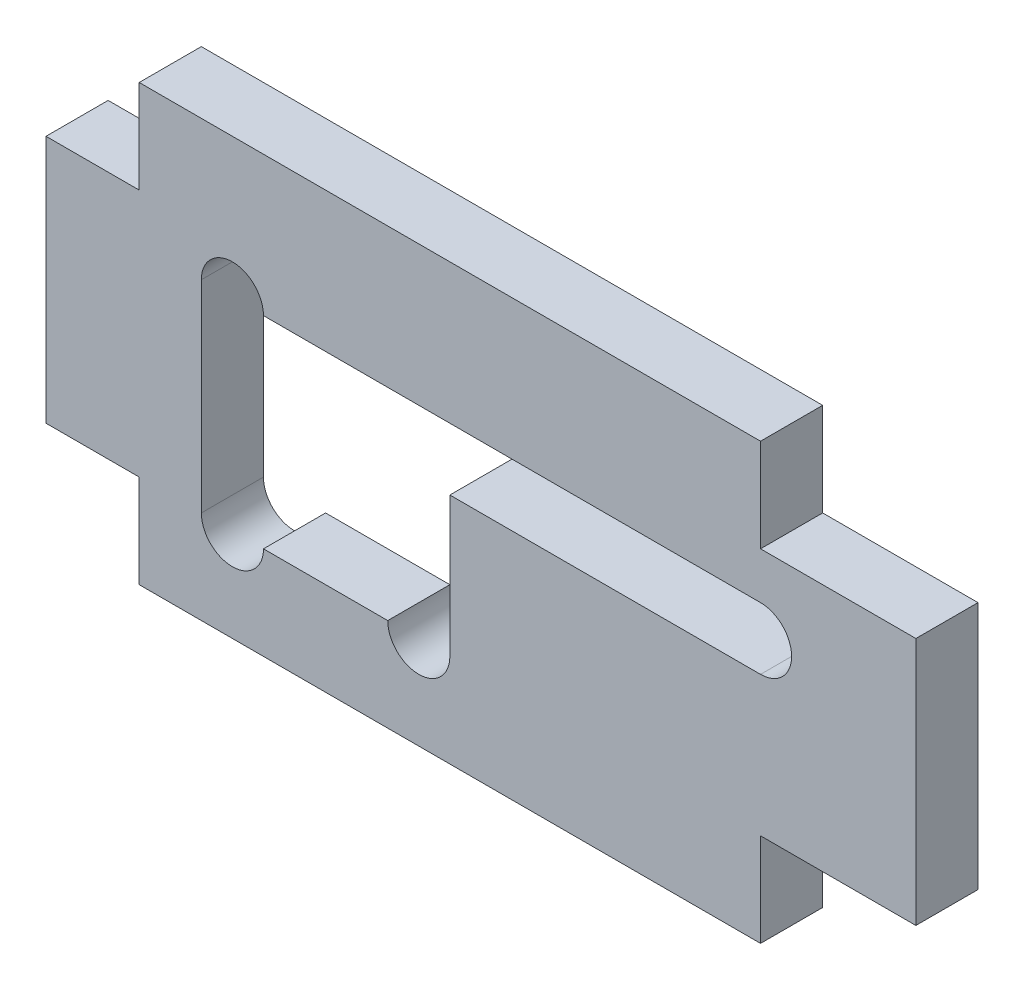
ISO-10303-21;
HEADER;
FILE_DESCRIPTION(('STEP AP214'),'2;1');
FILE_NAME('part.step','',(''),(''),'','','');
FILE_SCHEMA(('AUTOMOTIVE_DESIGN { 1 0 10303 214 1 1 1 1 }'));
ENDSEC;
DATA;
#1=APPLICATION_CONTEXT('core data for automotive mechanical design processes');
#2=APPLICATION_PROTOCOL_DEFINITION('international standard','automotive_design',2000,#1);
#3=PRODUCT_CONTEXT('',#1,'mechanical');
#4=PRODUCT('Part','Part','',(#3));
#5=PRODUCT_RELATED_PRODUCT_CATEGORY('part','',(#4));
#6=PRODUCT_DEFINITION_FORMATION('','',#4);
#7=PRODUCT_DEFINITION_CONTEXT('part definition',#1,'design');
#8=PRODUCT_DEFINITION('design','',#6,#7);
#9=PRODUCT_DEFINITION_SHAPE('','',#8);
#10=(LENGTH_UNIT() NAMED_UNIT(*) SI_UNIT(.MILLI.,.METRE.));
#11=(NAMED_UNIT(*) PLANE_ANGLE_UNIT() SI_UNIT($,.RADIAN.));
#12=(NAMED_UNIT(*) SI_UNIT($,.STERADIAN.) SOLID_ANGLE_UNIT());
#13=UNCERTAINTY_MEASURE_WITH_UNIT(LENGTH_MEASURE(1.E-05),#10,'distance_accuracy_value','');
#14=(GEOMETRIC_REPRESENTATION_CONTEXT(3) GLOBAL_UNCERTAINTY_ASSIGNED_CONTEXT((#13)) GLOBAL_UNIT_ASSIGNED_CONTEXT((#10,
#11,#12)) REPRESENTATION_CONTEXT('',''));
#15=CARTESIAN_POINT('',(0.,0.,0.));
#16=DIRECTION('',(0.,0.,1.));
#17=DIRECTION('',(1.,0.,0.));
#18=AXIS2_PLACEMENT_3D('',#15,#16,#17);
#19=CARTESIAN_POINT('',(0.,0.,2.));
#20=DIRECTION('',(0.,0.,-1.));
#21=DIRECTION('',(-1.,0.,0.));
#22=AXIS2_PLACEMENT_3D('',#19,#20,#21);
#23=PLANE('',#22);
#24=DIRECTION('',(1.,0.,0.));
#25=VECTOR('',#24,1.);
#26=CARTESIAN_POINT('',(-70.4851997337071,6.22089119945695,2.));
#27=LINE('',#26,#25);
#28=CARTESIAN_POINT('',(-80.4851997337071,6.22089119945695,2.));
#29=VERTEX_POINT('',#28);
#30=CARTESIAN_POINT('',(-75.4851997337071,6.22089119945695,2.));
#31=VERTEX_POINT('',#30);
#32=EDGE_CURVE('E266',#29,#31,#27,.T.);
#33=ORIENTED_EDGE('',*,*,#32,.T.);
#34=DIRECTION('',(0.,-1.,0.));
#35=VECTOR('',#34,1.);
#36=CARTESIAN_POINT('',(-75.4851997337071,14.2208911994569,2.));
#37=LINE('',#36,#35);
#38=CARTESIAN_POINT('',(-75.4851997337071,14.2208911994569,2.));
#39=VERTEX_POINT('',#38);
#40=EDGE_CURVE('E177',#39,#31,#37,.T.);
#41=ORIENTED_EDGE('',*,*,#40,.F.);
#42=DIRECTION('',(-1.,0.,0.));
#43=VECTOR('',#42,1.);
#44=CARTESIAN_POINT('',(-80.4851997337071,14.2208911994569,2.));
#45=LINE('',#44,#43);
#46=CARTESIAN_POINT('',(-80.4851997337071,14.2208911994569,2.));
#47=VERTEX_POINT('',#46);
#48=EDGE_CURVE('E269',#39,#47,#45,.T.);
#49=ORIENTED_EDGE('',*,*,#48,.T.);
#50=DIRECTION('',(0.,1.,0.));
#51=VECTOR('',#50,1.);
#52=CARTESIAN_POINT('',(-80.4851997337071,17.2208911994569,2.));
#53=LINE('',#52,#51);
#54=CARTESIAN_POINT('',(-80.4851997337071,17.2208911994569,2.));
#55=VERTEX_POINT('',#54);
#56=EDGE_CURVE('E276',#47,#55,#53,.T.);
#57=ORIENTED_EDGE('',*,*,#56,.T.);
#58=DIRECTION('',(-1.,0.,0.));
#59=VECTOR('',#58,1.);
#60=CARTESIAN_POINT('',(-100.485199733707,17.2208911994569,2.));
#61=LINE('',#60,#59);
#62=CARTESIAN_POINT('',(-100.485199733707,17.2208911994569,2.));
#63=VERTEX_POINT('',#62);
#64=EDGE_CURVE('E215',#55,#63,#61,.T.);
#65=ORIENTED_EDGE('',*,*,#64,.T.);
#66=DIRECTION('',(0.,-1.,0.));
#67=VECTOR('',#66,1.);
#68=CARTESIAN_POINT('',(-100.485199733707,14.2208911994569,2.));
#69=LINE('',#68,#67);
#70=CARTESIAN_POINT('',(-100.485199733707,14.2208911994569,2.));
#71=VERTEX_POINT('',#70);
#72=EDGE_CURVE('E210',#63,#71,#69,.T.);
#73=ORIENTED_EDGE('',*,*,#72,.T.);
#74=DIRECTION('',(-1.,0.,0.));
#75=VECTOR('',#74,1.);
#76=CARTESIAN_POINT('',(-103.485199733707,14.2208911994569,2.));
#77=LINE('',#76,#75);
#78=CARTESIAN_POINT('',(-103.485199733707,14.2208911994569,2.));
#79=VERTEX_POINT('',#78);
#80=EDGE_CURVE('E294',#71,#79,#77,.T.);
#81=ORIENTED_EDGE('',*,*,#80,.T.);
#82=DIRECTION('',(0.,-1.,0.));
#83=VECTOR('',#82,1.);
#84=CARTESIAN_POINT('',(-103.485199733707,6.2208911994569,2.));
#85=LINE('',#84,#83);
#86=CARTESIAN_POINT('',(-103.485199733707,6.2208911994569,2.));
#87=VERTEX_POINT('',#86);
#88=EDGE_CURVE('E241',#79,#87,#85,.T.);
#89=ORIENTED_EDGE('',*,*,#88,.T.);
#90=DIRECTION('',(1.,0.,0.));
#91=VECTOR('',#90,1.);
#92=CARTESIAN_POINT('',(-100.485199733707,6.2208911994569,2.));
#93=LINE('',#92,#91);
#94=CARTESIAN_POINT('',(-100.485199733707,6.2208911994569,2.));
#95=VERTEX_POINT('',#94);
#96=EDGE_CURVE('E297',#87,#95,#93,.T.);
#97=ORIENTED_EDGE('',*,*,#96,.T.);
#98=DIRECTION('',(0.,-1.,0.));
#99=VECTOR('',#98,1.);
#100=CARTESIAN_POINT('',(-100.485199733707,3.2208911994569,2.));
#101=LINE('',#100,#99);
#102=CARTESIAN_POINT('',(-100.485199733707,3.2208911994569,2.));
#103=VERTEX_POINT('',#102);
#104=EDGE_CURVE('E271',#95,#103,#101,.T.);
#105=ORIENTED_EDGE('',*,*,#104,.T.);
#106=DIRECTION('',(1.,0.,0.));
#107=VECTOR('',#106,1.);
#108=CARTESIAN_POINT('',(-80.4851997337071,3.2208911994569,2.));
#109=LINE('',#108,#107);
#110=CARTESIAN_POINT('',(-80.4851997337071,3.2208911994569,2.));
#111=VERTEX_POINT('',#110);
#112=EDGE_CURVE('E267',#103,#111,#109,.T.);
#113=ORIENTED_EDGE('',*,*,#112,.T.);
#114=DIRECTION('',(0.,1.,0.));
#115=VECTOR('',#114,1.);
#116=CARTESIAN_POINT('',(-80.4851997337071,6.22089119945695,2.));
#117=LINE('',#116,#115);
#118=EDGE_CURVE('E264',#111,#29,#117,.T.);
#119=ORIENTED_EDGE('',*,*,#118,.T.);
#120=EDGE_LOOP('',(#33,#41,#49,#57,#65,#73,#81,#89,#97,#105,#113,#119));
#121=FACE_BOUND('',#120,.T.);
#122=CARTESIAN_POINT('',(-97.4851997337071,12.7208911994569,2.));
#123=DIRECTION('',(0.,0.,1.));
#124=DIRECTION('',(1.,0.,0.));
#125=AXIS2_PLACEMENT_3D('',#122,#123,#124);
#126=CIRCLE('',#125,1.);
#127=CARTESIAN_POINT('',(-96.4851997337071,12.7208911994569,2.));
#128=VERTEX_POINT('',#127);
#129=CARTESIAN_POINT('',(-98.4851997337071,12.7208911994569,2.));
#130=VERTEX_POINT('',#129);
#131=EDGE_CURVE('E522',#128,#130,#126,.T.);
#132=ORIENTED_EDGE('',*,*,#131,.F.);
#133=DIRECTION('',(-1.,0.,0.));
#134=VECTOR('',#133,1.);
#135=CARTESIAN_POINT('',(-96.4851997337071,12.7208911994569,2.));
#136=LINE('',#135,#134);
#137=CARTESIAN_POINT('',(-80.4851997337071,12.7208911994569,2.));
#138=VERTEX_POINT('',#137);
#139=EDGE_CURVE('E539',#138,#128,#136,.T.);
#140=ORIENTED_EDGE('',*,*,#139,.F.);
#141=CARTESIAN_POINT('',(-80.4851997337071,11.7208911994569,2.));
#142=DIRECTION('',(0.,0.,1.));
#143=DIRECTION('',(1.,0.,0.));
#144=AXIS2_PLACEMENT_3D('',#141,#142,#143);
#145=CIRCLE('',#144,0.999999999999999);
#146=CARTESIAN_POINT('',(-80.4851997337071,10.7208911994569,2.));
#147=VERTEX_POINT('',#146);
#148=EDGE_CURVE('E537',#147,#138,#145,.T.);
#149=ORIENTED_EDGE('',*,*,#148,.F.);
#150=DIRECTION('',(1.,0.,0.));
#151=VECTOR('',#150,1.);
#152=CARTESIAN_POINT('',(-90.4851997337071,10.7208911994569,2.));
#153=LINE('',#152,#151);
#154=CARTESIAN_POINT('',(-90.4851997337071,10.7208911994569,2.));
#155=VERTEX_POINT('',#154);
#156=EDGE_CURVE('E535',#155,#147,#153,.T.);
#157=ORIENTED_EDGE('',*,*,#156,.F.);
#158=DIRECTION('',(0.,1.,0.));
#159=VECTOR('',#158,1.);
#160=CARTESIAN_POINT('',(-90.4851997337071,6.2208911994569,2.));
#161=LINE('',#160,#159);
#162=CARTESIAN_POINT('',(-90.4851997337071,6.2208911994569,2.));
#163=VERTEX_POINT('',#162);
#164=EDGE_CURVE('E533',#163,#155,#161,.T.);
#165=ORIENTED_EDGE('',*,*,#164,.F.);
#166=CARTESIAN_POINT('',(-91.4851997337071,6.2208911994569,2.));
#167=DIRECTION('',(0.,0.,1.));
#168=DIRECTION('',(1.,0.,0.));
#169=AXIS2_PLACEMENT_3D('',#166,#167,#168);
#170=CIRCLE('',#169,1.);
#171=CARTESIAN_POINT('',(-92.4851997337071,6.2208911994569,2.));
#172=VERTEX_POINT('',#171);
#173=EDGE_CURVE('E531',#172,#163,#170,.T.);
#174=ORIENTED_EDGE('',*,*,#173,.F.);
#175=DIRECTION('',(1.,0.,0.));
#176=VECTOR('',#175,1.);
#177=CARTESIAN_POINT('',(-96.4851997337071,6.2208911994569,2.));
#178=LINE('',#177,#176);
#179=CARTESIAN_POINT('',(-96.4851997337071,6.2208911994569,2.));
#180=VERTEX_POINT('',#179);
#181=EDGE_CURVE('E529',#180,#172,#178,.T.);
#182=ORIENTED_EDGE('',*,*,#181,.F.);
#183=CARTESIAN_POINT('',(-97.4851997337071,6.2208911994569,2.));
#184=DIRECTION('',(0.,0.,1.));
#185=DIRECTION('',(1.,0.,0.));
#186=AXIS2_PLACEMENT_3D('',#183,#184,#185);
#187=CIRCLE('',#186,1.);
#188=CARTESIAN_POINT('',(-98.4851997337071,6.2208911994569,2.));
#189=VERTEX_POINT('',#188);
#190=EDGE_CURVE('E527',#189,#180,#187,.T.);
#191=ORIENTED_EDGE('',*,*,#190,.F.);
#192=DIRECTION('',(0.,-1.,0.));
#193=VECTOR('',#192,1.);
#194=CARTESIAN_POINT('',(-98.4851997337071,12.7208911994569,2.));
#195=LINE('',#194,#193);
#196=EDGE_CURVE('E524',#130,#189,#195,.T.);
#197=ORIENTED_EDGE('',*,*,#196,.F.);
#198=EDGE_LOOP('',(#132,#140,#149,#157,#165,#174,#182,#191,#197));
#199=FACE_BOUND('',#198,.T.);
#200=ADVANCED_FACE('F33',(#121,#199),#23,.F.);
#201=CARTESIAN_POINT('',(0.,0.,0.));
#202=DIRECTION('',(0.,0.,-1.));
#203=DIRECTION('',(-1.,0.,0.));
#204=AXIS2_PLACEMENT_3D('',#201,#202,#203);
#205=PLANE('',#204);
#206=DIRECTION('',(0.,-1.,0.));
#207=VECTOR('',#206,1.);
#208=CARTESIAN_POINT('',(-75.4851997337071,14.2208911994569,0.));
#209=LINE('',#208,#207);
#210=CARTESIAN_POINT('',(-75.4851997337071,14.2208911994569,0.));
#211=VERTEX_POINT('',#210);
#212=CARTESIAN_POINT('',(-75.4851997337071,6.22089119945695,0.));
#213=VERTEX_POINT('',#212);
#214=EDGE_CURVE('E48',#211,#213,#209,.T.);
#215=ORIENTED_EDGE('',*,*,#214,.T.);
#216=DIRECTION('',(1.,0.,0.));
#217=VECTOR('',#216,1.);
#218=CARTESIAN_POINT('',(-70.4851997337071,6.22089119945695,0.));
#219=LINE('',#218,#217);
#220=CARTESIAN_POINT('',(-80.4851997337071,6.22089119945695,0.));
#221=VERTEX_POINT('',#220);
#222=EDGE_CURVE('E191',#221,#213,#219,.T.);
#223=ORIENTED_EDGE('',*,*,#222,.F.);
#224=DIRECTION('',(0.,1.,0.));
#225=VECTOR('',#224,1.);
#226=CARTESIAN_POINT('',(-80.4851997337071,6.22089119945695,0.));
#227=LINE('',#226,#225);
#228=CARTESIAN_POINT('',(-80.4851997337071,3.2208911994569,0.));
#229=VERTEX_POINT('',#228);
#230=EDGE_CURVE('E199',#229,#221,#227,.T.);
#231=ORIENTED_EDGE('',*,*,#230,.F.);
#232=DIRECTION('',(1.,0.,0.));
#233=VECTOR('',#232,1.);
#234=CARTESIAN_POINT('',(-80.4851997337071,3.2208911994569,0.));
#235=LINE('',#234,#233);
#236=CARTESIAN_POINT('',(-100.485199733707,3.2208911994569,0.));
#237=VERTEX_POINT('',#236);
#238=EDGE_CURVE('E203',#237,#229,#235,.T.);
#239=ORIENTED_EDGE('',*,*,#238,.F.);
#240=DIRECTION('',(0.,-1.,0.));
#241=VECTOR('',#240,1.);
#242=CARTESIAN_POINT('',(-100.485199733707,3.2208911994569,0.));
#243=LINE('',#242,#241);
#244=CARTESIAN_POINT('',(-100.485199733707,6.2208911994569,0.));
#245=VERTEX_POINT('',#244);
#246=EDGE_CURVE('E249',#245,#237,#243,.T.);
#247=ORIENTED_EDGE('',*,*,#246,.F.);
#248=DIRECTION('',(1.,0.,0.));
#249=VECTOR('',#248,1.);
#250=CARTESIAN_POINT('',(-100.485199733707,6.2208911994569,0.));
#251=LINE('',#250,#249);
#252=CARTESIAN_POINT('',(-103.485199733707,6.2208911994569,0.));
#253=VERTEX_POINT('',#252);
#254=EDGE_CURVE('E247',#253,#245,#251,.T.);
#255=ORIENTED_EDGE('',*,*,#254,.F.);
#256=DIRECTION('',(0.,-1.,0.));
#257=VECTOR('',#256,1.);
#258=CARTESIAN_POINT('',(-103.485199733707,6.2208911994569,0.));
#259=LINE('',#258,#257);
#260=CARTESIAN_POINT('',(-103.485199733707,14.2208911994569,0.));
#261=VERTEX_POINT('',#260);
#262=EDGE_CURVE('E240',#261,#253,#259,.T.);
#263=ORIENTED_EDGE('',*,*,#262,.F.);
#264=DIRECTION('',(-1.,0.,0.));
#265=VECTOR('',#264,1.);
#266=CARTESIAN_POINT('',(-103.485199733707,14.2208911994569,0.));
#267=LINE('',#266,#265);
#268=CARTESIAN_POINT('',(-100.485199733707,14.2208911994569,0.));
#269=VERTEX_POINT('',#268);
#270=EDGE_CURVE('E245',#269,#261,#267,.T.);
#271=ORIENTED_EDGE('',*,*,#270,.F.);
#272=DIRECTION('',(0.,-1.,0.));
#273=VECTOR('',#272,1.);
#274=CARTESIAN_POINT('',(-100.485199733707,14.2208911994569,0.));
#275=LINE('',#274,#273);
#276=CARTESIAN_POINT('',(-100.485199733707,17.2208911994569,0.));
#277=VERTEX_POINT('',#276);
#278=EDGE_CURVE('E251',#277,#269,#275,.T.);
#279=ORIENTED_EDGE('',*,*,#278,.F.);
#280=DIRECTION('',(-1.,0.,0.));
#281=VECTOR('',#280,1.);
#282=CARTESIAN_POINT('',(-100.485199733707,17.2208911994569,0.));
#283=LINE('',#282,#281);
#284=CARTESIAN_POINT('',(-80.4851997337071,17.2208911994569,0.));
#285=VERTEX_POINT('',#284);
#286=EDGE_CURVE('E208',#285,#277,#283,.T.);
#287=ORIENTED_EDGE('',*,*,#286,.F.);
#288=DIRECTION('',(0.,1.,0.));
#289=VECTOR('',#288,1.);
#290=CARTESIAN_POINT('',(-80.4851997337071,17.2208911994569,0.));
#291=LINE('',#290,#289);
#292=CARTESIAN_POINT('',(-80.4851997337071,14.2208911994569,0.));
#293=VERTEX_POINT('',#292);
#294=EDGE_CURVE('E201',#293,#285,#291,.T.);
#295=ORIENTED_EDGE('',*,*,#294,.F.);
#296=DIRECTION('',(-1.,0.,0.));
#297=VECTOR('',#296,1.);
#298=CARTESIAN_POINT('',(-80.4851997337071,14.2208911994569,0.));
#299=LINE('',#298,#297);
#300=EDGE_CURVE('E193',#211,#293,#299,.T.);
#301=ORIENTED_EDGE('',*,*,#300,.F.);
#302=EDGE_LOOP('',(#215,#223,#231,#239,#247,#255,#263,#271,#279,#287,#295,#301));
#303=FACE_BOUND('',#302,.T.);
#304=DIRECTION('',(-1.,0.,0.));
#305=VECTOR('',#304,1.);
#306=CARTESIAN_POINT('',(-96.4851997337071,12.7208911994569,0.));
#307=LINE('',#306,#305);
#308=CARTESIAN_POINT('',(-80.4851997337071,12.7208911994569,0.));
#309=VERTEX_POINT('',#308);
#310=CARTESIAN_POINT('',(-96.4851997337071,12.7208911994569,0.));
#311=VERTEX_POINT('',#310);
#312=EDGE_CURVE('E525',#309,#311,#307,.T.);
#313=ORIENTED_EDGE('',*,*,#312,.T.);
#314=CARTESIAN_POINT('',(-97.4851997337071,12.7208911994569,0.));
#315=DIRECTION('',(0.,0.,1.));
#316=DIRECTION('',(1.,0.,0.));
#317=AXIS2_PLACEMENT_3D('',#314,#315,#316);
#318=CIRCLE('',#317,1.);
#319=CARTESIAN_POINT('',(-98.4851997337071,12.7208911994569,0.));
#320=VERTEX_POINT('',#319);
#321=EDGE_CURVE('E182',#311,#320,#318,.T.);
#322=ORIENTED_EDGE('',*,*,#321,.T.);
#323=DIRECTION('',(0.,-1.,0.));
#324=VECTOR('',#323,1.);
#325=CARTESIAN_POINT('',(-98.4851997337071,12.7208911994569,0.));
#326=LINE('',#325,#324);
#327=CARTESIAN_POINT('',(-98.4851997337071,6.2208911994569,0.));
#328=VERTEX_POINT('',#327);
#329=EDGE_CURVE('E543',#320,#328,#326,.T.);
#330=ORIENTED_EDGE('',*,*,#329,.T.);
#331=CARTESIAN_POINT('',(-97.4851997337071,6.2208911994569,0.));
#332=DIRECTION('',(0.,0.,1.));
#333=DIRECTION('',(1.,0.,0.));
#334=AXIS2_PLACEMENT_3D('',#331,#332,#333);
#335=CIRCLE('',#334,1.);
#336=CARTESIAN_POINT('',(-96.4851997337071,6.2208911994569,0.));
#337=VERTEX_POINT('',#336);
#338=EDGE_CURVE('E546',#328,#337,#335,.T.);
#339=ORIENTED_EDGE('',*,*,#338,.T.);
#340=DIRECTION('',(1.,0.,0.));
#341=VECTOR('',#340,1.);
#342=CARTESIAN_POINT('',(-96.4851997337071,6.2208911994569,0.));
#343=LINE('',#342,#341);
#344=CARTESIAN_POINT('',(-92.4851997337071,6.2208911994569,0.));
#345=VERTEX_POINT('',#344);
#346=EDGE_CURVE('E549',#337,#345,#343,.T.);
#347=ORIENTED_EDGE('',*,*,#346,.T.);
#348=CARTESIAN_POINT('',(-91.4851997337071,6.2208911994569,0.));
#349=DIRECTION('',(0.,0.,1.));
#350=DIRECTION('',(1.,0.,0.));
#351=AXIS2_PLACEMENT_3D('',#348,#349,#350);
#352=CIRCLE('',#351,1.);
#353=CARTESIAN_POINT('',(-90.4851997337071,6.2208911994569,0.));
#354=VERTEX_POINT('',#353);
#355=EDGE_CURVE('E552',#345,#354,#352,.T.);
#356=ORIENTED_EDGE('',*,*,#355,.T.);
#357=DIRECTION('',(0.,1.,0.));
#358=VECTOR('',#357,1.);
#359=CARTESIAN_POINT('',(-90.4851997337071,6.2208911994569,0.));
#360=LINE('',#359,#358);
#361=CARTESIAN_POINT('',(-90.4851997337071,10.7208911994569,0.));
#362=VERTEX_POINT('',#361);
#363=EDGE_CURVE('E555',#354,#362,#360,.T.);
#364=ORIENTED_EDGE('',*,*,#363,.T.);
#365=DIRECTION('',(1.,0.,0.));
#366=VECTOR('',#365,1.);
#367=CARTESIAN_POINT('',(-90.4851997337071,10.7208911994569,0.));
#368=LINE('',#367,#366);
#369=CARTESIAN_POINT('',(-80.4851997337071,10.7208911994569,0.));
#370=VERTEX_POINT('',#369);
#371=EDGE_CURVE('E558',#362,#370,#368,.T.);
#372=ORIENTED_EDGE('',*,*,#371,.T.);
#373=CARTESIAN_POINT('',(-80.4851997337071,11.7208911994569,0.));
#374=DIRECTION('',(0.,0.,1.));
#375=DIRECTION('',(1.,0.,0.));
#376=AXIS2_PLACEMENT_3D('',#373,#374,#375);
#377=CIRCLE('',#376,0.999999999999999);
#378=EDGE_CURVE('E561',#370,#309,#377,.T.);
#379=ORIENTED_EDGE('',*,*,#378,.T.);
#380=EDGE_LOOP('',(#313,#322,#330,#339,#347,#356,#364,#372,#379));
#381=FACE_BOUND('',#380,.T.);
#382=ADVANCED_FACE('F188',(#303,#381),#205,.T.);
#383=CARTESIAN_POINT('',(-100.485199733707,14.2208911994569,2.));
#384=DIRECTION('',(1.,0.,0.));
#385=DIRECTION('',(0.,0.,-1.));
#386=AXIS2_PLACEMENT_3D('',#383,#384,#385);
#387=PLANE('',#386);
#388=ORIENTED_EDGE('',*,*,#278,.T.);
#389=DIRECTION('',(0.,0.,-1.));
#390=VECTOR('',#389,1.);
#391=CARTESIAN_POINT('',(-100.485199733707,14.2208911994569,2.));
#392=LINE('',#391,#390);
#393=EDGE_CURVE('E11',#71,#269,#392,.T.);
#394=ORIENTED_EDGE('',*,*,#393,.F.);
#395=ORIENTED_EDGE('',*,*,#72,.F.);
#396=DIRECTION('',(0.,0.,-1.));
#397=VECTOR('',#396,1.);
#398=CARTESIAN_POINT('',(-100.485199733707,17.2208911994569,2.));
#399=LINE('',#398,#397);
#400=EDGE_CURVE('E211',#63,#277,#399,.T.);
#401=ORIENTED_EDGE('',*,*,#400,.T.);
#402=EDGE_LOOP('',(#388,#394,#395,#401));
#403=FACE_BOUND('',#402,.T.);
#404=ADVANCED_FACE('F35',(#403),#387,.F.);
#405=CARTESIAN_POINT('',(-103.485199733707,14.2208911994569,2.));
#406=DIRECTION('',(0.,-1.,0.));
#407=DIRECTION('',(0.,0.,-1.));
#408=AXIS2_PLACEMENT_3D('',#405,#406,#407);
#409=PLANE('',#408);
#410=ORIENTED_EDGE('',*,*,#270,.T.);
#411=DIRECTION('',(0.,0.,-1.));
#412=VECTOR('',#411,1.);
#413=CARTESIAN_POINT('',(-103.485199733707,14.2208911994569,2.));
#414=LINE('',#413,#412);
#415=EDGE_CURVE('E41',#79,#261,#414,.T.);
#416=ORIENTED_EDGE('',*,*,#415,.F.);
#417=ORIENTED_EDGE('',*,*,#80,.F.);
#418=ORIENTED_EDGE('',*,*,#393,.T.);
#419=EDGE_LOOP('',(#410,#416,#417,#418));
#420=FACE_BOUND('',#419,.T.);
#421=ADVANCED_FACE('F313',(#420),#409,.F.);
#422=CARTESIAN_POINT('',(-103.485199733707,6.2208911994569,2.));
#423=DIRECTION('',(1.,0.,0.));
#424=DIRECTION('',(0.,0.,-1.));
#425=AXIS2_PLACEMENT_3D('',#422,#423,#424);
#426=PLANE('',#425);
#427=ORIENTED_EDGE('',*,*,#262,.T.);
#428=DIRECTION('',(0.,0.,-1.));
#429=VECTOR('',#428,1.);
#430=CARTESIAN_POINT('',(-103.485199733707,6.2208911994569,2.));
#431=LINE('',#430,#429);
#432=EDGE_CURVE('E231',#87,#253,#431,.T.);
#433=ORIENTED_EDGE('',*,*,#432,.F.);
#434=ORIENTED_EDGE('',*,*,#88,.F.);
#435=ORIENTED_EDGE('',*,*,#415,.T.);
#436=EDGE_LOOP('',(#427,#433,#434,#435));
#437=FACE_BOUND('',#436,.T.);
#438=ADVANCED_FACE('F238',(#437),#426,.F.);
#439=CARTESIAN_POINT('',(-100.485199733707,6.2208911994569,2.));
#440=DIRECTION('',(0.,1.,0.));
#441=DIRECTION('',(-1.,0.,0.));
#442=AXIS2_PLACEMENT_3D('',#439,#440,#441);
#443=PLANE('',#442);
#444=ORIENTED_EDGE('',*,*,#254,.T.);
#445=DIRECTION('',(0.,0.,-1.));
#446=VECTOR('',#445,1.);
#447=CARTESIAN_POINT('',(-100.485199733707,6.2208911994569,2.));
#448=LINE('',#447,#446);
#449=EDGE_CURVE('E228',#95,#245,#448,.T.);
#450=ORIENTED_EDGE('',*,*,#449,.F.);
#451=ORIENTED_EDGE('',*,*,#96,.F.);
#452=ORIENTED_EDGE('',*,*,#432,.T.);
#453=EDGE_LOOP('',(#444,#450,#451,#452));
#454=FACE_BOUND('',#453,.T.);
#455=ADVANCED_FACE('F305',(#454),#443,.F.);
#456=CARTESIAN_POINT('',(-100.485199733707,3.2208911994569,2.));
#457=DIRECTION('',(1.,0.,0.));
#458=DIRECTION('',(0.,0.,-1.));
#459=AXIS2_PLACEMENT_3D('',#456,#457,#458);
#460=PLANE('',#459);
#461=ORIENTED_EDGE('',*,*,#246,.T.);
#462=DIRECTION('',(0.,0.,-1.));
#463=VECTOR('',#462,1.);
#464=CARTESIAN_POINT('',(-100.485199733707,3.2208911994569,2.));
#465=LINE('',#464,#463);
#466=EDGE_CURVE('E225',#103,#237,#465,.T.);
#467=ORIENTED_EDGE('',*,*,#466,.F.);
#468=ORIENTED_EDGE('',*,*,#104,.F.);
#469=ORIENTED_EDGE('',*,*,#449,.T.);
#470=EDGE_LOOP('',(#461,#467,#468,#469));
#471=FACE_BOUND('',#470,.T.);
#472=ADVANCED_FACE('F303',(#471),#460,.F.);
#473=CARTESIAN_POINT('',(-80.4851997337071,3.2208911994569,2.));
#474=DIRECTION('',(0.,1.,0.));
#475=DIRECTION('',(-1.,0.,0.));
#476=AXIS2_PLACEMENT_3D('',#473,#474,#475);
#477=PLANE('',#476);
#478=ORIENTED_EDGE('',*,*,#238,.T.);
#479=DIRECTION('',(0.,0.,-1.));
#480=VECTOR('',#479,1.);
#481=CARTESIAN_POINT('',(-80.4851997337071,3.2208911994569,2.));
#482=LINE('',#481,#480);
#483=EDGE_CURVE('E222',#111,#229,#482,.T.);
#484=ORIENTED_EDGE('',*,*,#483,.F.);
#485=ORIENTED_EDGE('',*,*,#112,.F.);
#486=ORIENTED_EDGE('',*,*,#466,.T.);
#487=EDGE_LOOP('',(#478,#484,#485,#486));
#488=FACE_BOUND('',#487,.T.);
#489=ADVANCED_FACE('F258',(#488),#477,.F.);
#490=CARTESIAN_POINT('',(-80.4851997337071,6.22089119945695,2.));
#491=DIRECTION('',(-1.,0.,0.));
#492=DIRECTION('',(0.,0.,1.));
#493=AXIS2_PLACEMENT_3D('',#490,#491,#492);
#494=PLANE('',#493);
#495=ORIENTED_EDGE('',*,*,#230,.T.);
#496=DIRECTION('',(0.,0.,-1.));
#497=VECTOR('',#496,1.);
#498=CARTESIAN_POINT('',(-80.4851997337071,6.22089119945695,2.));
#499=LINE('',#498,#497);
#500=EDGE_CURVE('E198',#29,#221,#499,.T.);
#501=ORIENTED_EDGE('',*,*,#500,.F.);
#502=ORIENTED_EDGE('',*,*,#118,.F.);
#503=ORIENTED_EDGE('',*,*,#483,.T.);
#504=EDGE_LOOP('',(#495,#501,#502,#503));
#505=FACE_BOUND('',#504,.T.);
#506=ADVANCED_FACE('F263',(#505),#494,.F.);
#507=CARTESIAN_POINT('',(-70.4851997337071,6.22089119945695,2.));
#508=DIRECTION('',(0.,1.,0.));
#509=DIRECTION('',(-1.,0.,0.));
#510=AXIS2_PLACEMENT_3D('',#507,#508,#509);
#511=PLANE('',#510);
#512=ORIENTED_EDGE('',*,*,#222,.T.);
#513=DIRECTION('',(0.,0.,1.));
#514=VECTOR('',#513,1.);
#515=CARTESIAN_POINT('',(-75.4851997337071,6.22089119945695,0.));
#516=LINE('',#515,#514);
#517=EDGE_CURVE('E174',#213,#31,#516,.T.);
#518=ORIENTED_EDGE('',*,*,#517,.T.);
#519=ORIENTED_EDGE('',*,*,#32,.F.);
#520=ORIENTED_EDGE('',*,*,#500,.T.);
#521=EDGE_LOOP('',(#512,#518,#519,#520));
#522=FACE_BOUND('',#521,.T.);
#523=ADVANCED_FACE('F196',(#522),#511,.F.);
#524=CARTESIAN_POINT('',(-80.4851997337071,14.2208911994569,2.));
#525=DIRECTION('',(0.,-1.,0.));
#526=DIRECTION('',(0.,0.,-1.));
#527=AXIS2_PLACEMENT_3D('',#524,#525,#526);
#528=PLANE('',#527);
#529=ORIENTED_EDGE('',*,*,#48,.F.);
#530=DIRECTION('',(0.,0.,1.));
#531=VECTOR('',#530,1.);
#532=CARTESIAN_POINT('',(-75.4851997337071,14.2208911994569,0.));
#533=LINE('',#532,#531);
#534=EDGE_CURVE('E183',#211,#39,#533,.T.);
#535=ORIENTED_EDGE('',*,*,#534,.F.);
#536=ORIENTED_EDGE('',*,*,#300,.T.);
#537=DIRECTION('',(0.,0.,-1.));
#538=VECTOR('',#537,1.);
#539=CARTESIAN_POINT('',(-80.4851997337071,14.2208911994569,2.));
#540=LINE('',#539,#538);
#541=EDGE_CURVE('E218',#47,#293,#540,.T.);
#542=ORIENTED_EDGE('',*,*,#541,.F.);
#543=EDGE_LOOP('',(#529,#535,#536,#542));
#544=FACE_BOUND('',#543,.T.);
#545=ADVANCED_FACE('F332',(#544),#528,.F.);
#546=CARTESIAN_POINT('',(-80.4851997337071,17.2208911994569,2.));
#547=DIRECTION('',(-1.,0.,0.));
#548=DIRECTION('',(0.,0.,1.));
#549=AXIS2_PLACEMENT_3D('',#546,#547,#548);
#550=PLANE('',#549);
#551=ORIENTED_EDGE('',*,*,#294,.T.);
#552=DIRECTION('',(0.,0.,-1.));
#553=VECTOR('',#552,1.);
#554=CARTESIAN_POINT('',(-80.4851997337071,17.2208911994569,2.));
#555=LINE('',#554,#553);
#556=EDGE_CURVE('E214',#55,#285,#555,.T.);
#557=ORIENTED_EDGE('',*,*,#556,.F.);
#558=ORIENTED_EDGE('',*,*,#56,.F.);
#559=ORIENTED_EDGE('',*,*,#541,.T.);
#560=EDGE_LOOP('',(#551,#557,#558,#559));
#561=FACE_BOUND('',#560,.T.);
#562=ADVANCED_FACE('F328',(#561),#550,.F.);
#563=CARTESIAN_POINT('',(-100.485199733707,17.2208911994569,2.));
#564=DIRECTION('',(0.,-1.,0.));
#565=DIRECTION('',(0.,0.,-1.));
#566=AXIS2_PLACEMENT_3D('',#563,#564,#565);
#567=PLANE('',#566);
#568=ORIENTED_EDGE('',*,*,#286,.T.);
#569=ORIENTED_EDGE('',*,*,#400,.F.);
#570=ORIENTED_EDGE('',*,*,#64,.F.);
#571=ORIENTED_EDGE('',*,*,#556,.T.);
#572=EDGE_LOOP('',(#568,#569,#570,#571));
#573=FACE_BOUND('',#572,.T.);
#574=ADVANCED_FACE('F325',(#573),#567,.F.);
#575=CARTESIAN_POINT('',(-97.4851997337071,12.7208911994569,2.));
#576=DIRECTION('',(0.,0.,-1.));
#577=DIRECTION('',(-1.,0.,0.));
#578=AXIS2_PLACEMENT_3D('',#575,#576,#577);
#579=CYLINDRICAL_SURFACE('',#578,1.);
#580=ORIENTED_EDGE('',*,*,#321,.F.);
#581=DIRECTION('',(0.,0.,-1.));
#582=VECTOR('',#581,1.);
#583=CARTESIAN_POINT('',(-96.4851997337071,12.7208911994569,2.));
#584=LINE('',#583,#582);
#585=EDGE_CURVE('E541',#128,#311,#584,.T.);
#586=ORIENTED_EDGE('',*,*,#585,.F.);
#587=ORIENTED_EDGE('',*,*,#131,.T.);
#588=DIRECTION('',(0.,0.,-1.));
#589=VECTOR('',#588,1.);
#590=CARTESIAN_POINT('',(-98.4851997337071,12.7208911994569,2.));
#591=LINE('',#590,#589);
#592=EDGE_CURVE('E279',#130,#320,#591,.T.);
#593=ORIENTED_EDGE('',*,*,#592,.T.);
#594=EDGE_LOOP('',(#580,#586,#587,#593));
#595=FACE_BOUND('',#594,.T.);
#596=ADVANCED_FACE('F322',(#595),#579,.F.);
#597=CARTESIAN_POINT('',(-98.4851997337071,12.7208911994569,2.));
#598=DIRECTION('',(1.,0.,0.));
#599=DIRECTION('',(0.,0.,-1.));
#600=AXIS2_PLACEMENT_3D('',#597,#598,#599);
#601=PLANE('',#600);
#602=ORIENTED_EDGE('',*,*,#329,.F.);
#603=ORIENTED_EDGE('',*,*,#592,.F.);
#604=ORIENTED_EDGE('',*,*,#196,.T.);
#605=DIRECTION('',(0.,0.,-1.));
#606=VECTOR('',#605,1.);
#607=CARTESIAN_POINT('',(-98.4851997337071,6.2208911994569,2.));
#608=LINE('',#607,#606);
#609=EDGE_CURVE('E283',#189,#328,#608,.T.);
#610=ORIENTED_EDGE('',*,*,#609,.T.);
#611=EDGE_LOOP('',(#602,#603,#604,#610));
#612=FACE_BOUND('',#611,.T.);
#613=ADVANCED_FACE('F374',(#612),#601,.T.);
#614=CARTESIAN_POINT('',(-97.4851997337071,6.2208911994569,2.));
#615=DIRECTION('',(0.,0.,-1.));
#616=DIRECTION('',(-1.,0.,0.));
#617=AXIS2_PLACEMENT_3D('',#614,#615,#616);
#618=CYLINDRICAL_SURFACE('',#617,1.);
#619=ORIENTED_EDGE('',*,*,#338,.F.);
#620=ORIENTED_EDGE('',*,*,#609,.F.);
#621=ORIENTED_EDGE('',*,*,#190,.T.);
#622=DIRECTION('',(0.,0.,-1.));
#623=VECTOR('',#622,1.);
#624=CARTESIAN_POINT('',(-96.4851997337071,6.2208911994569,2.));
#625=LINE('',#624,#623);
#626=EDGE_CURVE('E288',#180,#337,#625,.T.);
#627=ORIENTED_EDGE('',*,*,#626,.T.);
#628=EDGE_LOOP('',(#619,#620,#621,#627));
#629=FACE_BOUND('',#628,.T.);
#630=ADVANCED_FACE('F380',(#629),#618,.F.);
#631=CARTESIAN_POINT('',(-96.4851997337071,6.2208911994569,2.));
#632=DIRECTION('',(0.,1.,0.));
#633=DIRECTION('',(0.,0.,1.));
#634=AXIS2_PLACEMENT_3D('',#631,#632,#633);
#635=PLANE('',#634);
#636=ORIENTED_EDGE('',*,*,#346,.F.);
#637=ORIENTED_EDGE('',*,*,#626,.F.);
#638=ORIENTED_EDGE('',*,*,#181,.T.);
#639=DIRECTION('',(0.,0.,-1.));
#640=VECTOR('',#639,1.);
#641=CARTESIAN_POINT('',(-92.4851997337071,6.2208911994569,2.));
#642=LINE('',#641,#640);
#643=EDGE_CURVE('E575',#172,#345,#642,.T.);
#644=ORIENTED_EDGE('',*,*,#643,.T.);
#645=EDGE_LOOP('',(#636,#637,#638,#644));
#646=FACE_BOUND('',#645,.T.);
#647=ADVANCED_FACE('F387',(#646),#635,.T.);
#648=CARTESIAN_POINT('',(-91.4851997337071,6.2208911994569,2.));
#649=DIRECTION('',(0.,0.,-1.));
#650=DIRECTION('',(-1.,0.,0.));
#651=AXIS2_PLACEMENT_3D('',#648,#649,#650);
#652=CYLINDRICAL_SURFACE('',#651,1.);
#653=ORIENTED_EDGE('',*,*,#355,.F.);
#654=ORIENTED_EDGE('',*,*,#643,.F.);
#655=ORIENTED_EDGE('',*,*,#173,.T.);
#656=DIRECTION('',(0.,0.,-1.));
#657=VECTOR('',#656,1.);
#658=CARTESIAN_POINT('',(-90.4851997337071,6.2208911994569,2.));
#659=LINE('',#658,#657);
#660=EDGE_CURVE('E573',#163,#354,#659,.T.);
#661=ORIENTED_EDGE('',*,*,#660,.T.);
#662=EDGE_LOOP('',(#653,#654,#655,#661));
#663=FACE_BOUND('',#662,.T.);
#664=ADVANCED_FACE('F395',(#663),#652,.F.);
#665=CARTESIAN_POINT('',(-90.4851997337071,6.2208911994569,2.));
#666=DIRECTION('',(-1.,0.,0.));
#667=DIRECTION('',(0.,0.,1.));
#668=AXIS2_PLACEMENT_3D('',#665,#666,#667);
#669=PLANE('',#668);
#670=ORIENTED_EDGE('',*,*,#363,.F.);
#671=ORIENTED_EDGE('',*,*,#660,.F.);
#672=ORIENTED_EDGE('',*,*,#164,.T.);
#673=DIRECTION('',(0.,0.,-1.));
#674=VECTOR('',#673,1.);
#675=CARTESIAN_POINT('',(-90.4851997337071,10.7208911994569,2.));
#676=LINE('',#675,#674);
#677=EDGE_CURVE('E571',#155,#362,#676,.T.);
#678=ORIENTED_EDGE('',*,*,#677,.T.);
#679=EDGE_LOOP('',(#670,#671,#672,#678));
#680=FACE_BOUND('',#679,.T.);
#681=ADVANCED_FACE('F403',(#680),#669,.T.);
#682=CARTESIAN_POINT('',(-90.4851997337071,10.7208911994569,2.));
#683=DIRECTION('',(0.,1.,0.));
#684=DIRECTION('',(0.,0.,1.));
#685=AXIS2_PLACEMENT_3D('',#682,#683,#684);
#686=PLANE('',#685);
#687=ORIENTED_EDGE('',*,*,#371,.F.);
#688=ORIENTED_EDGE('',*,*,#677,.F.);
#689=ORIENTED_EDGE('',*,*,#156,.T.);
#690=DIRECTION('',(0.,0.,-1.));
#691=VECTOR('',#690,1.);
#692=CARTESIAN_POINT('',(-80.4851997337071,10.7208911994569,2.));
#693=LINE('',#692,#691);
#694=EDGE_CURVE('E569',#147,#370,#693,.T.);
#695=ORIENTED_EDGE('',*,*,#694,.T.);
#696=EDGE_LOOP('',(#687,#688,#689,#695));
#697=FACE_BOUND('',#696,.T.);
#698=ADVANCED_FACE('F411',(#697),#686,.T.);
#699=CARTESIAN_POINT('',(-80.4851997337071,11.7208911994569,2.));
#700=DIRECTION('',(0.,0.,-1.));
#701=DIRECTION('',(-1.,0.,0.));
#702=AXIS2_PLACEMENT_3D('',#699,#700,#701);
#703=CYLINDRICAL_SURFACE('',#702,0.999999999999999);
#704=ORIENTED_EDGE('',*,*,#378,.F.);
#705=ORIENTED_EDGE('',*,*,#694,.F.);
#706=ORIENTED_EDGE('',*,*,#148,.T.);
#707=DIRECTION('',(0.,0.,-1.));
#708=VECTOR('',#707,1.);
#709=CARTESIAN_POINT('',(-80.4851997337071,12.7208911994569,2.));
#710=LINE('',#709,#708);
#711=EDGE_CURVE('E56',#138,#309,#710,.T.);
#712=ORIENTED_EDGE('',*,*,#711,.T.);
#713=EDGE_LOOP('',(#704,#705,#706,#712));
#714=FACE_BOUND('',#713,.T.);
#715=ADVANCED_FACE('F419',(#714),#703,.F.);
#716=CARTESIAN_POINT('',(-96.4851997337071,12.7208911994569,2.));
#717=DIRECTION('',(0.,-1.,0.));
#718=DIRECTION('',(0.,0.,-1.));
#719=AXIS2_PLACEMENT_3D('',#716,#717,#718);
#720=PLANE('',#719);
#721=ORIENTED_EDGE('',*,*,#312,.F.);
#722=ORIENTED_EDGE('',*,*,#711,.F.);
#723=ORIENTED_EDGE('',*,*,#139,.T.);
#724=ORIENTED_EDGE('',*,*,#585,.T.);
#725=EDGE_LOOP('',(#721,#722,#723,#724));
#726=FACE_BOUND('',#725,.T.);
#727=ADVANCED_FACE('F427',(#726),#720,.T.);
#728=CARTESIAN_POINT('',(-75.4851997337071,14.2208911994569,0.));
#729=DIRECTION('',(-1.,0.,0.));
#730=DIRECTION('',(0.,0.,1.));
#731=AXIS2_PLACEMENT_3D('',#728,#729,#730);
#732=PLANE('',#731);
#733=ORIENTED_EDGE('',*,*,#40,.T.);
#734=ORIENTED_EDGE('',*,*,#517,.F.);
#735=ORIENTED_EDGE('',*,*,#214,.F.);
#736=ORIENTED_EDGE('',*,*,#534,.T.);
#737=EDGE_LOOP('',(#733,#734,#735,#736));
#738=FACE_BOUND('',#737,.T.);
#739=ADVANCED_FACE('F175',(#738),#732,.F.);
#740=CLOSED_SHELL('',(#200,#382,#404,#421,#438,#455,#472,#489,#506,#523,#545,#562,#574,#596,
#613,#630,#647,#664,#681,#698,#715,#727,#739));
#741=MANIFOLD_SOLID_BREP('B2',#740);
#742=ADVANCED_BREP_SHAPE_REPRESENTATION('',(#18,#741),#14);
#743=SHAPE_DEFINITION_REPRESENTATION(#9,#742);
ENDSEC;
END-ISO-10303-21;
